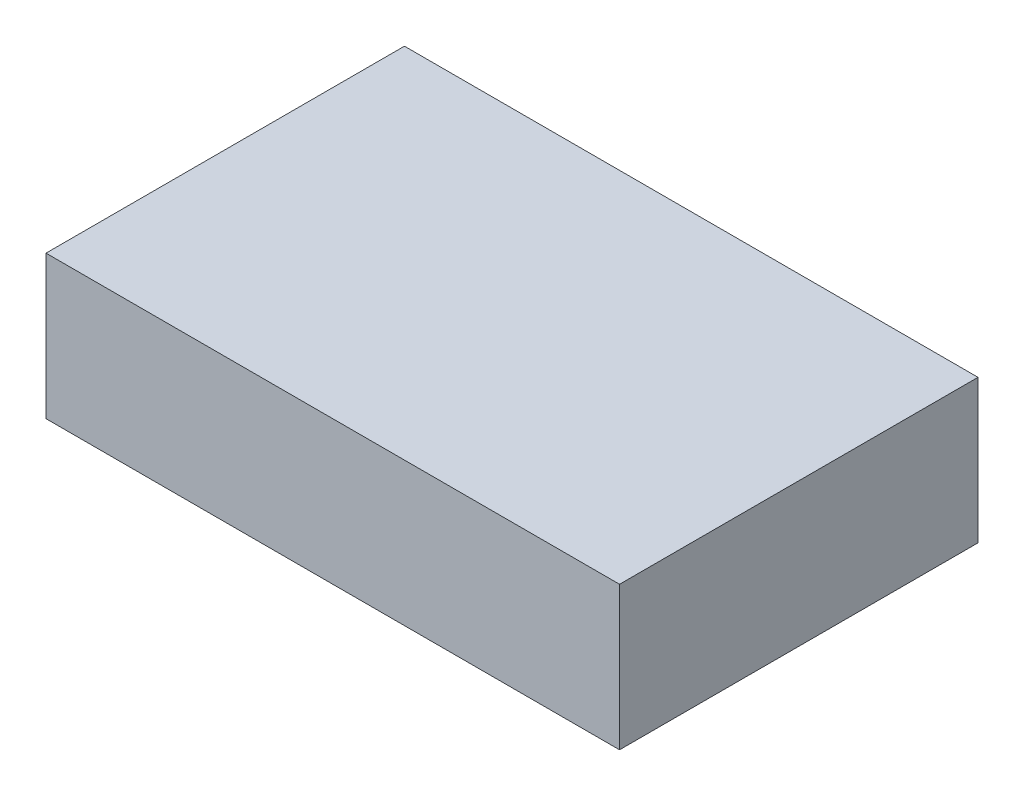
ISO-10303-21;
HEADER;
FILE_DESCRIPTION(('STEP AP214'),'2;1');
FILE_NAME('part.step','',(''),(''),'','','');
FILE_SCHEMA(('AUTOMOTIVE_DESIGN { 1 0 10303 214 1 1 1 1 }'));
ENDSEC;
DATA;
#1=APPLICATION_CONTEXT('core data for automotive mechanical design processes');
#2=APPLICATION_PROTOCOL_DEFINITION('international standard','automotive_design',2000,#1);
#3=PRODUCT_CONTEXT('',#1,'mechanical');
#4=PRODUCT('Part','Part','',(#3));
#5=PRODUCT_RELATED_PRODUCT_CATEGORY('part','',(#4));
#6=PRODUCT_DEFINITION_FORMATION('','',#4);
#7=PRODUCT_DEFINITION_CONTEXT('part definition',#1,'design');
#8=PRODUCT_DEFINITION('design','',#6,#7);
#9=PRODUCT_DEFINITION_SHAPE('','',#8);
#10=(LENGTH_UNIT() NAMED_UNIT(*) SI_UNIT(.MILLI.,.METRE.));
#11=(NAMED_UNIT(*) PLANE_ANGLE_UNIT() SI_UNIT($,.RADIAN.));
#12=(NAMED_UNIT(*) SI_UNIT($,.STERADIAN.) SOLID_ANGLE_UNIT());
#13=UNCERTAINTY_MEASURE_WITH_UNIT(LENGTH_MEASURE(1.E-05),#10,'distance_accuracy_value','');
#14=(GEOMETRIC_REPRESENTATION_CONTEXT(3) GLOBAL_UNCERTAINTY_ASSIGNED_CONTEXT((#13)) GLOBAL_UNIT_ASSIGNED_CONTEXT((#10,
#11,#12)) REPRESENTATION_CONTEXT('',''));
#15=CARTESIAN_POINT('',(0.,0.,0.));
#16=DIRECTION('',(0.,0.,1.));
#17=DIRECTION('',(1.,0.,0.));
#18=AXIS2_PLACEMENT_3D('',#15,#16,#17);
#19=CARTESIAN_POINT('',(50.8,-25.4,-25.4));
#20=DIRECTION('',(1.,0.,0.));
#21=DIRECTION('',(0.,0.,-1.));
#22=AXIS2_PLACEMENT_3D('',#19,#20,#21);
#23=PLANE('',#22);
#24=DIRECTION('',(0.,0.,-1.));
#25=VECTOR('',#24,1.);
#26=CARTESIAN_POINT('',(50.8,0.,-25.4));
#27=LINE('',#26,#25);
#28=CARTESIAN_POINT('',(50.8,0.,38.1));
#29=VERTEX_POINT('',#28);
#30=CARTESIAN_POINT('',(50.8,0.,-25.4));
#31=VERTEX_POINT('',#30);
#32=EDGE_CURVE('E95',#29,#31,#27,.T.);
#33=ORIENTED_EDGE('',*,*,#32,.F.);
#34=DIRECTION('',(0.,1.,0.));
#35=VECTOR('',#34,1.);
#36=CARTESIAN_POINT('',(50.8,-25.4,38.1));
#37=LINE('',#36,#35);
#38=CARTESIAN_POINT('',(50.8,-25.4,38.1));
#39=VERTEX_POINT('',#38);
#40=EDGE_CURVE('E11',#39,#29,#37,.T.);
#41=ORIENTED_EDGE('',*,*,#40,.F.);
#42=DIRECTION('',(0.,0.,-1.));
#43=VECTOR('',#42,1.);
#44=CARTESIAN_POINT('',(50.8,-25.4,-25.4));
#45=LINE('',#44,#43);
#46=CARTESIAN_POINT('',(50.8,-25.4,-25.4));
#47=VERTEX_POINT('',#46);
#48=EDGE_CURVE('E89',#39,#47,#45,.T.);
#49=ORIENTED_EDGE('',*,*,#48,.T.);
#50=DIRECTION('',(0.,1.,0.));
#51=VECTOR('',#50,1.);
#52=CARTESIAN_POINT('',(50.8,-25.4,-25.4));
#53=LINE('',#52,#51);
#54=EDGE_CURVE('E34',#47,#31,#53,.T.);
#55=ORIENTED_EDGE('',*,*,#54,.T.);
#56=EDGE_LOOP('',(#33,#41,#49,#55));
#57=FACE_BOUND('',#56,.T.);
#58=ADVANCED_FACE('F31',(#57),#23,.T.);
#59=CARTESIAN_POINT('',(-50.8,-25.4,38.1));
#60=DIRECTION('',(0.,0.,1.));
#61=DIRECTION('',(1.,0.,0.));
#62=AXIS2_PLACEMENT_3D('',#59,#60,#61);
#63=PLANE('',#62);
#64=DIRECTION('',(1.,0.,0.));
#65=VECTOR('',#64,1.);
#66=CARTESIAN_POINT('',(-50.8,0.,38.1));
#67=LINE('',#66,#65);
#68=CARTESIAN_POINT('',(-50.8,0.,38.1));
#69=VERTEX_POINT('',#68);
#70=EDGE_CURVE('E91',#69,#29,#67,.T.);
#71=ORIENTED_EDGE('',*,*,#70,.F.);
#72=DIRECTION('',(0.,1.,0.));
#73=VECTOR('',#72,1.);
#74=CARTESIAN_POINT('',(-50.8,-25.4,38.1));
#75=LINE('',#74,#73);
#76=CARTESIAN_POINT('',(-50.8,-25.4,38.1));
#77=VERTEX_POINT('',#76);
#78=EDGE_CURVE('E40',#77,#69,#75,.T.);
#79=ORIENTED_EDGE('',*,*,#78,.F.);
#80=DIRECTION('',(1.,0.,0.));
#81=VECTOR('',#80,1.);
#82=CARTESIAN_POINT('',(-50.8,-25.4,38.1));
#83=LINE('',#82,#81);
#84=EDGE_CURVE('E86',#77,#39,#83,.T.);
#85=ORIENTED_EDGE('',*,*,#84,.T.);
#86=ORIENTED_EDGE('',*,*,#40,.T.);
#87=EDGE_LOOP('',(#71,#79,#85,#86));
#88=FACE_BOUND('',#87,.T.);
#89=ADVANCED_FACE('F105',(#88),#63,.T.);
#90=CARTESIAN_POINT('',(-50.8,-25.4,-25.4));
#91=DIRECTION('',(-1.,0.,0.));
#92=DIRECTION('',(0.,0.,1.));
#93=AXIS2_PLACEMENT_3D('',#90,#91,#92);
#94=PLANE('',#93);
#95=DIRECTION('',(0.,0.,1.));
#96=VECTOR('',#95,1.);
#97=CARTESIAN_POINT('',(-50.8,0.,-25.4));
#98=LINE('',#97,#96);
#99=CARTESIAN_POINT('',(-50.8,0.,-25.4));
#100=VERTEX_POINT('',#99);
#101=EDGE_CURVE('E81',#100,#69,#98,.T.);
#102=ORIENTED_EDGE('',*,*,#101,.F.);
#103=DIRECTION('',(0.,1.,0.));
#104=VECTOR('',#103,1.);
#105=CARTESIAN_POINT('',(-50.8,-25.4,-25.4));
#106=LINE('',#105,#104);
#107=CARTESIAN_POINT('',(-50.8,-25.4,-25.4));
#108=VERTEX_POINT('',#107);
#109=EDGE_CURVE('E76',#108,#100,#106,.T.);
#110=ORIENTED_EDGE('',*,*,#109,.F.);
#111=DIRECTION('',(0.,0.,1.));
#112=VECTOR('',#111,1.);
#113=CARTESIAN_POINT('',(-50.8,-25.4,-25.4));
#114=LINE('',#113,#112);
#115=EDGE_CURVE('E79',#108,#77,#114,.T.);
#116=ORIENTED_EDGE('',*,*,#115,.T.);
#117=ORIENTED_EDGE('',*,*,#78,.T.);
#118=EDGE_LOOP('',(#102,#110,#116,#117));
#119=FACE_BOUND('',#118,.T.);
#120=ADVANCED_FACE('F78',(#119),#94,.T.);
#121=CARTESIAN_POINT('',(-50.8,-25.4,-25.4));
#122=DIRECTION('',(0.,0.,-1.));
#123=DIRECTION('',(-1.,0.,0.));
#124=AXIS2_PLACEMENT_3D('',#121,#122,#123);
#125=PLANE('',#124);
#126=DIRECTION('',(-1.,0.,0.));
#127=VECTOR('',#126,1.);
#128=CARTESIAN_POINT('',(-50.8,0.,-25.4));
#129=LINE('',#128,#127);
#130=EDGE_CURVE('E98',#31,#100,#129,.T.);
#131=ORIENTED_EDGE('',*,*,#130,.F.);
#132=ORIENTED_EDGE('',*,*,#54,.F.);
#133=DIRECTION('',(-1.,0.,0.));
#134=VECTOR('',#133,1.);
#135=CARTESIAN_POINT('',(-50.8,-25.4,-25.4));
#136=LINE('',#135,#134);
#137=EDGE_CURVE('E85',#47,#108,#136,.T.);
#138=ORIENTED_EDGE('',*,*,#137,.T.);
#139=ORIENTED_EDGE('',*,*,#109,.T.);
#140=EDGE_LOOP('',(#131,#132,#138,#139));
#141=FACE_BOUND('',#140,.T.);
#142=ADVANCED_FACE('F88',(#141),#125,.T.);
#143=CARTESIAN_POINT('',(50.8,-25.4,38.1));
#144=DIRECTION('',(0.,1.,0.));
#145=DIRECTION('',(0.,0.,1.));
#146=AXIS2_PLACEMENT_3D('',#143,#144,#145);
#147=PLANE('',#146);
#148=ORIENTED_EDGE('',*,*,#48,.F.);
#149=ORIENTED_EDGE('',*,*,#84,.F.);
#150=ORIENTED_EDGE('',*,*,#115,.F.);
#151=ORIENTED_EDGE('',*,*,#137,.F.);
#152=EDGE_LOOP('',(#148,#149,#150,#151));
#153=FACE_BOUND('',#152,.T.);
#154=ADVANCED_FACE('F84',(#153),#147,.F.);
#155=CARTESIAN_POINT('',(50.8,0.,38.1));
#156=DIRECTION('',(0.,1.,0.));
#157=DIRECTION('',(0.,0.,1.));
#158=AXIS2_PLACEMENT_3D('',#155,#156,#157);
#159=PLANE('',#158);
#160=ORIENTED_EDGE('',*,*,#32,.T.);
#161=ORIENTED_EDGE('',*,*,#130,.T.);
#162=ORIENTED_EDGE('',*,*,#101,.T.);
#163=ORIENTED_EDGE('',*,*,#70,.T.);
#164=EDGE_LOOP('',(#160,#161,#162,#163));
#165=FACE_BOUND('',#164,.T.);
#166=ADVANCED_FACE('F104',(#165),#159,.T.);
#167=CLOSED_SHELL('',(#58,#89,#120,#142,#154,#166));
#168=MANIFOLD_SOLID_BREP('B2',#167);
#169=ADVANCED_BREP_SHAPE_REPRESENTATION('',(#18,#168),#14);
#170=SHAPE_DEFINITION_REPRESENTATION(#9,#169);
ENDSEC;
END-ISO-10303-21;
